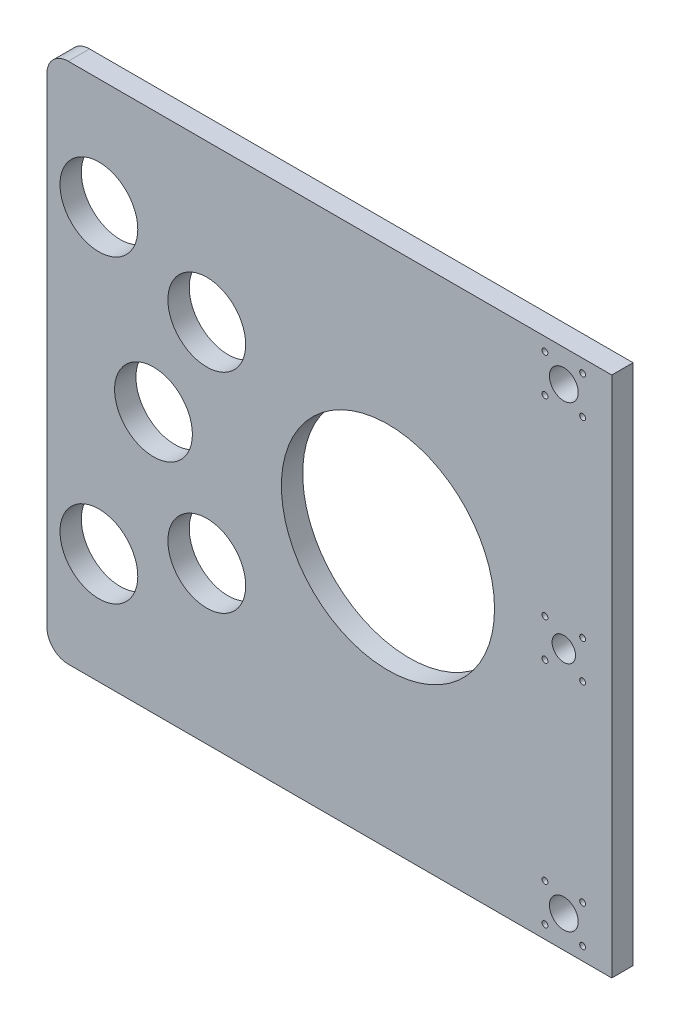
ISO-10303-21;
HEADER;
FILE_DESCRIPTION(('STEP AP214'),'2;1');
FILE_NAME('part.step','',(''),(''),'','','');
FILE_SCHEMA(('AUTOMOTIVE_DESIGN { 1 0 10303 214 1 1 1 1 }'));
ENDSEC;
DATA;
#1=APPLICATION_CONTEXT('core data for automotive mechanical design processes');
#2=APPLICATION_PROTOCOL_DEFINITION('international standard','automotive_design',2000,#1);
#3=PRODUCT_CONTEXT('',#1,'mechanical');
#4=PRODUCT('Part','Part','',(#3));
#5=PRODUCT_RELATED_PRODUCT_CATEGORY('part','',(#4));
#6=PRODUCT_DEFINITION_FORMATION('','',#4);
#7=PRODUCT_DEFINITION_CONTEXT('part definition',#1,'design');
#8=PRODUCT_DEFINITION('design','',#6,#7);
#9=PRODUCT_DEFINITION_SHAPE('','',#8);
#10=(LENGTH_UNIT() NAMED_UNIT(*) SI_UNIT(.MILLI.,.METRE.));
#11=(NAMED_UNIT(*) PLANE_ANGLE_UNIT() SI_UNIT($,.RADIAN.));
#12=(NAMED_UNIT(*) SI_UNIT($,.STERADIAN.) SOLID_ANGLE_UNIT());
#13=UNCERTAINTY_MEASURE_WITH_UNIT(LENGTH_MEASURE(1.E-05),#10,'distance_accuracy_value','');
#14=(GEOMETRIC_REPRESENTATION_CONTEXT(3) GLOBAL_UNCERTAINTY_ASSIGNED_CONTEXT((#13)) GLOBAL_UNIT_ASSIGNED_CONTEXT((#10,
#11,#12)) REPRESENTATION_CONTEXT('',''));
#15=CARTESIAN_POINT('',(0.,0.,0.));
#16=DIRECTION('',(0.,0.,1.));
#17=DIRECTION('',(1.,0.,0.));
#18=AXIS2_PLACEMENT_3D('',#15,#16,#17);
#19=CARTESIAN_POINT('',(430.,0.,20.));
#20=DIRECTION('',(1.,0.,0.));
#21=DIRECTION('',(0.,0.,-1.));
#22=AXIS2_PLACEMENT_3D('',#19,#20,#21);
#23=PLANE('',#22);
#24=DIRECTION('',(0.,-1.,0.));
#25=VECTOR('',#24,1.);
#26=CARTESIAN_POINT('',(430.,0.,0.));
#27=LINE('',#26,#25);
#28=CARTESIAN_POINT('',(430.,245.,0.));
#29=VERTEX_POINT('',#28);
#30=CARTESIAN_POINT('',(430.,-245.,0.));
#31=VERTEX_POINT('',#30);
#32=EDGE_CURVE('E104',#29,#31,#27,.T.);
#33=ORIENTED_EDGE('',*,*,#32,.F.);
#34=DIRECTION('',(0.,0.,-1.));
#35=VECTOR('',#34,1.);
#36=CARTESIAN_POINT('',(430.,245.,20.));
#37=LINE('',#36,#35);
#38=CARTESIAN_POINT('',(430.,245.,20.));
#39=VERTEX_POINT('',#38);
#40=EDGE_CURVE('E93',#39,#29,#37,.T.);
#41=ORIENTED_EDGE('',*,*,#40,.F.);
#42=DIRECTION('',(0.,-1.,0.));
#43=VECTOR('',#42,1.);
#44=CARTESIAN_POINT('',(430.,0.,20.));
#45=LINE('',#44,#43);
#46=CARTESIAN_POINT('',(430.,-245.,20.));
#47=VERTEX_POINT('',#46);
#48=EDGE_CURVE('E98',#39,#47,#45,.T.);
#49=ORIENTED_EDGE('',*,*,#48,.T.);
#50=DIRECTION('',(0.,0.,-1.));
#51=VECTOR('',#50,1.);
#52=CARTESIAN_POINT('',(430.,-245.,20.));
#53=LINE('',#52,#51);
#54=EDGE_CURVE('E106',#47,#31,#53,.T.);
#55=ORIENTED_EDGE('',*,*,#54,.T.);
#56=EDGE_LOOP('',(#33,#41,#49,#55));
#57=FACE_BOUND('',#56,.T.);
#58=ADVANCED_FACE('F37',(#57),#23,.T.);
#59=CARTESIAN_POINT('',(0.,245.,20.));
#60=DIRECTION('',(0.,1.,0.));
#61=DIRECTION('',(0.,0.,1.));
#62=AXIS2_PLACEMENT_3D('',#59,#60,#61);
#63=PLANE('',#62);
#64=DIRECTION('',(1.,0.,0.));
#65=VECTOR('',#64,1.);
#66=CARTESIAN_POINT('',(0.,245.,0.));
#67=LINE('',#66,#65);
#68=CARTESIAN_POINT('',(-80.,245.,0.));
#69=VERTEX_POINT('',#68);
#70=EDGE_CURVE('E183',#69,#29,#67,.T.);
#71=ORIENTED_EDGE('',*,*,#70,.F.);
#72=DIRECTION('',(0.,0.,-1.));
#73=VECTOR('',#72,1.);
#74=CARTESIAN_POINT('',(-80.,245.,20.));
#75=LINE('',#74,#73);
#76=CARTESIAN_POINT('',(-80.,245.,20.));
#77=VERTEX_POINT('',#76);
#78=EDGE_CURVE('E60',#69,#77,#75,.F.);
#79=ORIENTED_EDGE('',*,*,#78,.T.);
#80=DIRECTION('',(1.,0.,0.));
#81=VECTOR('',#80,1.);
#82=CARTESIAN_POINT('',(0.,245.,20.));
#83=LINE('',#82,#81);
#84=EDGE_CURVE('E90',#77,#39,#83,.T.);
#85=ORIENTED_EDGE('',*,*,#84,.T.);
#86=ORIENTED_EDGE('',*,*,#40,.T.);
#87=EDGE_LOOP('',(#71,#79,#85,#86));
#88=FACE_BOUND('',#87,.T.);
#89=ADVANCED_FACE('F92',(#88),#63,.T.);
#90=CARTESIAN_POINT('',(-100.,0.,20.));
#91=DIRECTION('',(1.,0.,0.));
#92=DIRECTION('',(0.,0.,-1.));
#93=AXIS2_PLACEMENT_3D('',#90,#91,#92);
#94=PLANE('',#93);
#95=DIRECTION('',(0.,-1.,0.));
#96=VECTOR('',#95,1.);
#97=CARTESIAN_POINT('',(-100.,0.,20.));
#98=LINE('',#97,#96);
#99=CARTESIAN_POINT('',(-100.,225.,20.));
#100=VERTEX_POINT('',#99);
#101=CARTESIAN_POINT('',(-100.,-225.,20.));
#102=VERTEX_POINT('',#101);
#103=EDGE_CURVE('E97',#100,#102,#98,.T.);
#104=ORIENTED_EDGE('',*,*,#103,.F.);
#105=DIRECTION('',(0.,0.,-1.));
#106=VECTOR('',#105,1.);
#107=CARTESIAN_POINT('',(-100.,225.,0.));
#108=LINE('',#107,#106);
#109=CARTESIAN_POINT('',(-100.,225.,0.));
#110=VERTEX_POINT('',#109);
#111=EDGE_CURVE('E232',#100,#110,#108,.T.);
#112=ORIENTED_EDGE('',*,*,#111,.T.);
#113=DIRECTION('',(0.,-1.,0.));
#114=VECTOR('',#113,1.);
#115=CARTESIAN_POINT('',(-100.,0.,0.));
#116=LINE('',#115,#114);
#117=CARTESIAN_POINT('',(-100.,-225.,0.));
#118=VERTEX_POINT('',#117);
#119=EDGE_CURVE('E185',#110,#118,#116,.T.);
#120=ORIENTED_EDGE('',*,*,#119,.T.);
#121=DIRECTION('',(0.,0.,-1.));
#122=VECTOR('',#121,1.);
#123=CARTESIAN_POINT('',(-100.,-225.,20.));
#124=LINE('',#123,#122);
#125=EDGE_CURVE('E105',#118,#102,#124,.F.);
#126=ORIENTED_EDGE('',*,*,#125,.T.);
#127=EDGE_LOOP('',(#104,#112,#120,#126));
#128=FACE_BOUND('',#127,.T.);
#129=ADVANCED_FACE('F244',(#128),#94,.F.);
#130=CARTESIAN_POINT('',(402.677669529664,-197.322330470336,20.));
#131=DIRECTION('',(0.,0.,-1.));
#132=DIRECTION('',(-1.,0.,0.));
#133=AXIS2_PLACEMENT_3D('',#130,#131,#132);
#134=CYLINDRICAL_SURFACE('',#133,2.75000000000004);
#135=CARTESIAN_POINT('',(402.677669529664,-197.322330470336,20.));
#136=DIRECTION('',(0.,0.,1.));
#137=DIRECTION('',(1.,0.,0.));
#138=AXIS2_PLACEMENT_3D('',#135,#136,#137);
#139=CIRCLE('',#138,2.75000000000004);
#140=CARTESIAN_POINT('',(405.427669529664,-197.322330470336,20.));
#141=VERTEX_POINT('',#140);
#142=EDGE_CURVE('E154',#141,#141,#139,.F.);
#143=ORIENTED_EDGE('',*,*,#142,.F.);
#144=EDGE_LOOP('',(#143));
#145=FACE_BOUND('',#144,.T.);
#146=CARTESIAN_POINT('',(402.677669529664,-197.322330470336,0.));
#147=DIRECTION('',(0.,0.,1.));
#148=DIRECTION('',(1.,0.,0.));
#149=AXIS2_PLACEMENT_3D('',#146,#147,#148);
#150=CIRCLE('',#149,2.75000000000004);
#151=CARTESIAN_POINT('',(405.427669529664,-197.322330470336,0.));
#152=VERTEX_POINT('',#151);
#153=EDGE_CURVE('E223',#152,#152,#150,.F.);
#154=ORIENTED_EDGE('',*,*,#153,.T.);
#155=EDGE_LOOP('',(#154));
#156=FACE_BOUND('',#155,.T.);
#157=ADVANCED_FACE('F322',(#145,#156),#134,.F.);
#158=CARTESIAN_POINT('',(367.322330470336,-232.677669529664,20.));
#159=DIRECTION('',(0.,0.,-1.));
#160=DIRECTION('',(-1.,0.,0.));
#161=AXIS2_PLACEMENT_3D('',#158,#159,#160);
#162=CYLINDRICAL_SURFACE('',#161,2.75000000000004);
#163=CARTESIAN_POINT('',(367.322330470336,-232.677669529664,20.));
#164=DIRECTION('',(0.,0.,1.));
#165=DIRECTION('',(1.,0.,0.));
#166=AXIS2_PLACEMENT_3D('',#163,#164,#165);
#167=CIRCLE('',#166,2.75000000000004);
#168=CARTESIAN_POINT('',(370.072330470336,-232.677669529664,20.));
#169=VERTEX_POINT('',#168);
#170=EDGE_CURVE('E151',#169,#169,#167,.F.);
#171=ORIENTED_EDGE('',*,*,#170,.F.);
#172=EDGE_LOOP('',(#171));
#173=FACE_BOUND('',#172,.T.);
#174=CARTESIAN_POINT('',(367.322330470336,-232.677669529664,0.));
#175=DIRECTION('',(0.,0.,1.));
#176=DIRECTION('',(1.,0.,0.));
#177=AXIS2_PLACEMENT_3D('',#174,#175,#176);
#178=CIRCLE('',#177,2.75000000000004);
#179=CARTESIAN_POINT('',(370.072330470336,-232.677669529664,0.));
#180=VERTEX_POINT('',#179);
#181=EDGE_CURVE('E220',#180,#180,#178,.F.);
#182=ORIENTED_EDGE('',*,*,#181,.T.);
#183=EDGE_LOOP('',(#182));
#184=FACE_BOUND('',#183,.T.);
#185=ADVANCED_FACE('F325',(#173,#184),#162,.F.);
#186=CARTESIAN_POINT('',(367.322330470336,232.677669529664,20.));
#187=DIRECTION('',(0.,0.,-1.));
#188=DIRECTION('',(-1.,0.,0.));
#189=AXIS2_PLACEMENT_3D('',#186,#187,#188);
#190=CYLINDRICAL_SURFACE('',#189,2.75000000000027);
#191=CARTESIAN_POINT('',(367.322330470336,232.677669529664,20.));
#192=DIRECTION('',(0.,0.,1.));
#193=DIRECTION('',(1.,0.,0.));
#194=AXIS2_PLACEMENT_3D('',#191,#192,#193);
#195=CIRCLE('',#194,2.75000000000027);
#196=CARTESIAN_POINT('',(370.072330470337,232.677669529664,20.));
#197=VERTEX_POINT('',#196);
#198=EDGE_CURVE('E148',#197,#197,#195,.T.);
#199=ORIENTED_EDGE('',*,*,#198,.T.);
#200=EDGE_LOOP('',(#199));
#201=FACE_BOUND('',#200,.T.);
#202=CARTESIAN_POINT('',(367.322330470336,232.677669529664,0.));
#203=DIRECTION('',(0.,0.,1.));
#204=DIRECTION('',(1.,0.,0.));
#205=AXIS2_PLACEMENT_3D('',#202,#203,#204);
#206=CIRCLE('',#205,2.75000000000027);
#207=CARTESIAN_POINT('',(370.072330470337,232.677669529664,0.));
#208=VERTEX_POINT('',#207);
#209=EDGE_CURVE('E217',#208,#208,#206,.T.);
#210=ORIENTED_EDGE('',*,*,#209,.F.);
#211=EDGE_LOOP('',(#210));
#212=FACE_BOUND('',#211,.T.);
#213=ADVANCED_FACE('F329',(#201,#212),#190,.F.);
#214=CARTESIAN_POINT('',(402.677669529664,232.677669529664,20.));
#215=DIRECTION('',(0.,0.,-1.));
#216=DIRECTION('',(-1.,0.,0.));
#217=AXIS2_PLACEMENT_3D('',#214,#215,#216);
#218=CYLINDRICAL_SURFACE('',#217,2.75000000000004);
#219=CARTESIAN_POINT('',(402.677669529664,232.677669529664,20.));
#220=DIRECTION('',(0.,0.,1.));
#221=DIRECTION('',(1.,0.,0.));
#222=AXIS2_PLACEMENT_3D('',#219,#220,#221);
#223=CIRCLE('',#222,2.75000000000004);
#224=CARTESIAN_POINT('',(405.427669529664,232.677669529664,20.));
#225=VERTEX_POINT('',#224);
#226=EDGE_CURVE('E145',#225,#225,#223,.T.);
#227=ORIENTED_EDGE('',*,*,#226,.T.);
#228=EDGE_LOOP('',(#227));
#229=FACE_BOUND('',#228,.T.);
#230=CARTESIAN_POINT('',(402.677669529664,232.677669529664,0.));
#231=DIRECTION('',(0.,0.,1.));
#232=DIRECTION('',(1.,0.,0.));
#233=AXIS2_PLACEMENT_3D('',#230,#231,#232);
#234=CIRCLE('',#233,2.75000000000004);
#235=CARTESIAN_POINT('',(405.427669529664,232.677669529664,0.));
#236=VERTEX_POINT('',#235);
#237=EDGE_CURVE('E214',#236,#236,#234,.T.);
#238=ORIENTED_EDGE('',*,*,#237,.F.);
#239=EDGE_LOOP('',(#238));
#240=FACE_BOUND('',#239,.T.);
#241=ADVANCED_FACE('F333',(#229,#240),#218,.F.);
#242=CARTESIAN_POINT('',(402.677669529664,197.322330470336,20.));
#243=DIRECTION('',(0.,0.,-1.));
#244=DIRECTION('',(-1.,0.,0.));
#245=AXIS2_PLACEMENT_3D('',#242,#243,#244);
#246=CYLINDRICAL_SURFACE('',#245,2.75000000000004);
#247=CARTESIAN_POINT('',(402.677669529664,197.322330470336,20.));
#248=DIRECTION('',(0.,0.,1.));
#249=DIRECTION('',(1.,0.,0.));
#250=AXIS2_PLACEMENT_3D('',#247,#248,#249);
#251=CIRCLE('',#250,2.75000000000004);
#252=CARTESIAN_POINT('',(405.427669529664,197.322330470336,20.));
#253=VERTEX_POINT('',#252);
#254=EDGE_CURVE('E142',#253,#253,#251,.T.);
#255=ORIENTED_EDGE('',*,*,#254,.T.);
#256=EDGE_LOOP('',(#255));
#257=FACE_BOUND('',#256,.T.);
#258=CARTESIAN_POINT('',(402.677669529664,197.322330470336,0.));
#259=DIRECTION('',(0.,0.,1.));
#260=DIRECTION('',(1.,0.,0.));
#261=AXIS2_PLACEMENT_3D('',#258,#259,#260);
#262=CIRCLE('',#261,2.75000000000004);
#263=CARTESIAN_POINT('',(405.427669529664,197.322330470336,0.));
#264=VERTEX_POINT('',#263);
#265=EDGE_CURVE('E211',#264,#264,#262,.T.);
#266=ORIENTED_EDGE('',*,*,#265,.F.);
#267=EDGE_LOOP('',(#266));
#268=FACE_BOUND('',#267,.T.);
#269=ADVANCED_FACE('F337',(#257,#268),#246,.F.);
#270=CARTESIAN_POINT('',(367.322330470336,197.322330470336,20.));
#271=DIRECTION('',(0.,0.,-1.));
#272=DIRECTION('',(-1.,0.,0.));
#273=AXIS2_PLACEMENT_3D('',#270,#271,#272);
#274=CYLINDRICAL_SURFACE('',#273,2.75000000000004);
#275=CARTESIAN_POINT('',(367.322330470336,197.322330470336,20.));
#276=DIRECTION('',(0.,0.,1.));
#277=DIRECTION('',(1.,0.,0.));
#278=AXIS2_PLACEMENT_3D('',#275,#276,#277);
#279=CIRCLE('',#278,2.75000000000004);
#280=CARTESIAN_POINT('',(370.072330470336,197.322330470336,20.));
#281=VERTEX_POINT('',#280);
#282=EDGE_CURVE('E139',#281,#281,#279,.T.);
#283=ORIENTED_EDGE('',*,*,#282,.T.);
#284=EDGE_LOOP('',(#283));
#285=FACE_BOUND('',#284,.T.);
#286=CARTESIAN_POINT('',(367.322330470336,197.322330470336,0.));
#287=DIRECTION('',(0.,0.,1.));
#288=DIRECTION('',(1.,0.,0.));
#289=AXIS2_PLACEMENT_3D('',#286,#287,#288);
#290=CIRCLE('',#289,2.75000000000004);
#291=CARTESIAN_POINT('',(370.072330470336,197.322330470336,0.));
#292=VERTEX_POINT('',#291);
#293=EDGE_CURVE('E208',#292,#292,#290,.T.);
#294=ORIENTED_EDGE('',*,*,#293,.F.);
#295=EDGE_LOOP('',(#294));
#296=FACE_BOUND('',#295,.T.);
#297=ADVANCED_FACE('F341',(#285,#296),#274,.F.);
#298=CARTESIAN_POINT('',(385.,215.,20.));
#299=DIRECTION('',(0.,0.,-1.));
#300=DIRECTION('',(-1.,0.,0.));
#301=AXIS2_PLACEMENT_3D('',#298,#299,#300);
#302=CYLINDRICAL_SURFACE('',#301,13.5);
#303=CARTESIAN_POINT('',(385.,215.,20.));
#304=DIRECTION('',(0.,0.,1.));
#305=DIRECTION('',(1.,0.,0.));
#306=AXIS2_PLACEMENT_3D('',#303,#304,#305);
#307=CIRCLE('',#306,13.5);
#308=CARTESIAN_POINT('',(398.5,215.,20.));
#309=VERTEX_POINT('',#308);
#310=EDGE_CURVE('E136',#309,#309,#307,.T.);
#311=ORIENTED_EDGE('',*,*,#310,.T.);
#312=EDGE_LOOP('',(#311));
#313=FACE_BOUND('',#312,.T.);
#314=CARTESIAN_POINT('',(385.,215.,0.));
#315=DIRECTION('',(0.,0.,1.));
#316=DIRECTION('',(1.,0.,0.));
#317=AXIS2_PLACEMENT_3D('',#314,#315,#316);
#318=CIRCLE('',#317,13.5);
#319=CARTESIAN_POINT('',(398.5,215.,0.));
#320=VERTEX_POINT('',#319);
#321=EDGE_CURVE('E205',#320,#320,#318,.T.);
#322=ORIENTED_EDGE('',*,*,#321,.F.);
#323=EDGE_LOOP('',(#322));
#324=FACE_BOUND('',#323,.T.);
#325=ADVANCED_FACE('F345',(#313,#324),#302,.F.);
#326=CARTESIAN_POINT('',(402.677669529664,-17.6776695296638,20.));
#327=DIRECTION('',(0.,0.,-1.));
#328=DIRECTION('',(-1.,0.,0.));
#329=AXIS2_PLACEMENT_3D('',#326,#327,#328);
#330=CYLINDRICAL_SURFACE('',#329,2.75000000000004);
#331=CARTESIAN_POINT('',(402.677669529664,-17.6776695296638,20.));
#332=DIRECTION('',(0.,0.,1.));
#333=DIRECTION('',(1.,0.,0.));
#334=AXIS2_PLACEMENT_3D('',#331,#332,#333);
#335=CIRCLE('',#334,2.75000000000004);
#336=CARTESIAN_POINT('',(405.427669529664,-17.6776695296638,20.));
#337=VERTEX_POINT('',#336);
#338=EDGE_CURVE('E133',#337,#337,#335,.T.);
#339=ORIENTED_EDGE('',*,*,#338,.T.);
#340=EDGE_LOOP('',(#339));
#341=FACE_BOUND('',#340,.T.);
#342=CARTESIAN_POINT('',(402.677669529664,-17.6776695296638,0.));
#343=DIRECTION('',(0.,0.,1.));
#344=DIRECTION('',(1.,0.,0.));
#345=AXIS2_PLACEMENT_3D('',#342,#343,#344);
#346=CIRCLE('',#345,2.75000000000004);
#347=CARTESIAN_POINT('',(405.427669529664,-17.6776695296638,0.));
#348=VERTEX_POINT('',#347);
#349=EDGE_CURVE('E202',#348,#348,#346,.T.);
#350=ORIENTED_EDGE('',*,*,#349,.F.);
#351=EDGE_LOOP('',(#350));
#352=FACE_BOUND('',#351,.T.);
#353=ADVANCED_FACE('F349',(#341,#352),#330,.F.);
#354=CARTESIAN_POINT('',(367.322330470336,-17.6776695296638,20.));
#355=DIRECTION('',(0.,0.,-1.));
#356=DIRECTION('',(-1.,0.,0.));
#357=AXIS2_PLACEMENT_3D('',#354,#355,#356);
#358=CYLINDRICAL_SURFACE('',#357,2.75000000000004);
#359=CARTESIAN_POINT('',(367.322330470336,-17.6776695296638,20.));
#360=DIRECTION('',(0.,0.,1.));
#361=DIRECTION('',(1.,0.,0.));
#362=AXIS2_PLACEMENT_3D('',#359,#360,#361);
#363=CIRCLE('',#362,2.75000000000004);
#364=CARTESIAN_POINT('',(370.072330470336,-17.6776695296638,20.));
#365=VERTEX_POINT('',#364);
#366=EDGE_CURVE('E130',#365,#365,#363,.T.);
#367=ORIENTED_EDGE('',*,*,#366,.T.);
#368=EDGE_LOOP('',(#367));
#369=FACE_BOUND('',#368,.T.);
#370=CARTESIAN_POINT('',(367.322330470336,-17.6776695296638,0.));
#371=DIRECTION('',(0.,0.,1.));
#372=DIRECTION('',(1.,0.,0.));
#373=AXIS2_PLACEMENT_3D('',#370,#371,#372);
#374=CIRCLE('',#373,2.75000000000004);
#375=CARTESIAN_POINT('',(370.072330470336,-17.6776695296638,0.));
#376=VERTEX_POINT('',#375);
#377=EDGE_CURVE('E199',#376,#376,#374,.T.);
#378=ORIENTED_EDGE('',*,*,#377,.F.);
#379=EDGE_LOOP('',(#378));
#380=FACE_BOUND('',#379,.T.);
#381=ADVANCED_FACE('F353',(#369,#380),#358,.F.);
#382=CARTESIAN_POINT('',(402.677669529664,17.6776695296638,20.));
#383=DIRECTION('',(0.,0.,-1.));
#384=DIRECTION('',(-1.,0.,0.));
#385=AXIS2_PLACEMENT_3D('',#382,#383,#384);
#386=CYLINDRICAL_SURFACE('',#385,2.75000000000004);
#387=CARTESIAN_POINT('',(402.677669529664,17.6776695296638,20.));
#388=DIRECTION('',(0.,0.,1.));
#389=DIRECTION('',(1.,0.,0.));
#390=AXIS2_PLACEMENT_3D('',#387,#388,#389);
#391=CIRCLE('',#390,2.75000000000004);
#392=CARTESIAN_POINT('',(405.427669529664,17.6776695296638,20.));
#393=VERTEX_POINT('',#392);
#394=EDGE_CURVE('E127',#393,#393,#391,.T.);
#395=ORIENTED_EDGE('',*,*,#394,.T.);
#396=EDGE_LOOP('',(#395));
#397=FACE_BOUND('',#396,.T.);
#398=CARTESIAN_POINT('',(402.677669529664,17.6776695296638,0.));
#399=DIRECTION('',(0.,0.,1.));
#400=DIRECTION('',(1.,0.,0.));
#401=AXIS2_PLACEMENT_3D('',#398,#399,#400);
#402=CIRCLE('',#401,2.75000000000004);
#403=CARTESIAN_POINT('',(405.427669529664,17.6776695296638,0.));
#404=VERTEX_POINT('',#403);
#405=EDGE_CURVE('E196',#404,#404,#402,.T.);
#406=ORIENTED_EDGE('',*,*,#405,.F.);
#407=EDGE_LOOP('',(#406));
#408=FACE_BOUND('',#407,.T.);
#409=ADVANCED_FACE('F357',(#397,#408),#386,.F.);
#410=CARTESIAN_POINT('',(367.322330470336,17.6776695296638,20.));
#411=DIRECTION('',(0.,0.,-1.));
#412=DIRECTION('',(-1.,0.,0.));
#413=AXIS2_PLACEMENT_3D('',#410,#411,#412);
#414=CYLINDRICAL_SURFACE('',#413,2.75000000000004);
#415=CARTESIAN_POINT('',(367.322330470336,17.6776695296638,20.));
#416=DIRECTION('',(0.,0.,1.));
#417=DIRECTION('',(1.,0.,0.));
#418=AXIS2_PLACEMENT_3D('',#415,#416,#417);
#419=CIRCLE('',#418,2.75000000000004);
#420=CARTESIAN_POINT('',(370.072330470336,17.6776695296638,20.));
#421=VERTEX_POINT('',#420);
#422=EDGE_CURVE('E124',#421,#421,#419,.T.);
#423=ORIENTED_EDGE('',*,*,#422,.T.);
#424=EDGE_LOOP('',(#423));
#425=FACE_BOUND('',#424,.T.);
#426=CARTESIAN_POINT('',(367.322330470336,17.6776695296638,0.));
#427=DIRECTION('',(0.,0.,1.));
#428=DIRECTION('',(1.,0.,0.));
#429=AXIS2_PLACEMENT_3D('',#426,#427,#428);
#430=CIRCLE('',#429,2.75000000000004);
#431=CARTESIAN_POINT('',(370.072330470336,17.6776695296638,0.));
#432=VERTEX_POINT('',#431);
#433=EDGE_CURVE('E193',#432,#432,#430,.T.);
#434=ORIENTED_EDGE('',*,*,#433,.F.);
#435=EDGE_LOOP('',(#434));
#436=FACE_BOUND('',#435,.T.);
#437=ADVANCED_FACE('F267',(#425,#436),#414,.F.);
#438=CARTESIAN_POINT('',(385.,0.,20.));
#439=DIRECTION('',(0.,0.,-1.));
#440=DIRECTION('',(-1.,0.,0.));
#441=AXIS2_PLACEMENT_3D('',#438,#439,#440);
#442=CYLINDRICAL_SURFACE('',#441,11.);
#443=CARTESIAN_POINT('',(385.,0.,20.));
#444=DIRECTION('',(0.,0.,1.));
#445=DIRECTION('',(1.,0.,0.));
#446=AXIS2_PLACEMENT_3D('',#443,#444,#445);
#447=CIRCLE('',#446,11.);
#448=CARTESIAN_POINT('',(396.,0.,20.));
#449=VERTEX_POINT('',#448);
#450=EDGE_CURVE('E121',#449,#449,#447,.T.);
#451=ORIENTED_EDGE('',*,*,#450,.T.);
#452=EDGE_LOOP('',(#451));
#453=FACE_BOUND('',#452,.T.);
#454=CARTESIAN_POINT('',(385.,0.,0.));
#455=DIRECTION('',(0.,0.,1.));
#456=DIRECTION('',(1.,0.,0.));
#457=AXIS2_PLACEMENT_3D('',#454,#455,#456);
#458=CIRCLE('',#457,11.);
#459=CARTESIAN_POINT('',(396.,0.,0.));
#460=VERTEX_POINT('',#459);
#461=EDGE_CURVE('E190',#460,#460,#458,.T.);
#462=ORIENTED_EDGE('',*,*,#461,.F.);
#463=EDGE_LOOP('',(#462));
#464=FACE_BOUND('',#463,.T.);
#465=ADVANCED_FACE('F258',(#453,#464),#442,.F.);
#466=CARTESIAN_POINT('',(0.,-245.,20.));
#467=DIRECTION('',(0.,1.,0.));
#468=DIRECTION('',(0.,0.,1.));
#469=AXIS2_PLACEMENT_3D('',#466,#467,#468);
#470=PLANE('',#469);
#471=DIRECTION('',(1.,0.,0.));
#472=VECTOR('',#471,1.);
#473=CARTESIAN_POINT('',(0.,-245.,20.));
#474=LINE('',#473,#472);
#475=CARTESIAN_POINT('',(-80.,-245.,20.));
#476=VERTEX_POINT('',#475);
#477=EDGE_CURVE('E110',#476,#47,#474,.T.);
#478=ORIENTED_EDGE('',*,*,#477,.F.);
#479=DIRECTION('',(0.,0.,-1.));
#480=VECTOR('',#479,1.);
#481=CARTESIAN_POINT('',(-80.,-245.,20.));
#482=LINE('',#481,#480);
#483=CARTESIAN_POINT('',(-80.,-245.,0.));
#484=VERTEX_POINT('',#483);
#485=EDGE_CURVE('E11',#476,#484,#482,.T.);
#486=ORIENTED_EDGE('',*,*,#485,.T.);
#487=DIRECTION('',(1.,0.,0.));
#488=VECTOR('',#487,1.);
#489=CARTESIAN_POINT('',(0.,-245.,0.));
#490=LINE('',#489,#488);
#491=EDGE_CURVE('E188',#484,#31,#490,.T.);
#492=ORIENTED_EDGE('',*,*,#491,.T.);
#493=ORIENTED_EDGE('',*,*,#54,.F.);
#494=EDGE_LOOP('',(#478,#486,#492,#493));
#495=FACE_BOUND('',#494,.T.);
#496=ADVANCED_FACE('F255',(#495),#470,.F.);
#497=CARTESIAN_POINT('',(0.,0.,20.));
#498=DIRECTION('',(0.,0.,-1.));
#499=DIRECTION('',(-1.,0.,0.));
#500=AXIS2_PLACEMENT_3D('',#497,#498,#499);
#501=CYLINDRICAL_SURFACE('',#500,36.5);
#502=CARTESIAN_POINT('',(0.,0.,20.));
#503=DIRECTION('',(0.,0.,1.));
#504=DIRECTION('',(1.,0.,0.));
#505=AXIS2_PLACEMENT_3D('',#502,#503,#504);
#506=CIRCLE('',#505,36.5);
#507=CARTESIAN_POINT('',(36.5,0.,20.));
#508=VERTEX_POINT('',#507);
#509=EDGE_CURVE('E112',#508,#508,#506,.T.);
#510=ORIENTED_EDGE('',*,*,#509,.T.);
#511=EDGE_LOOP('',(#510));
#512=FACE_BOUND('',#511,.T.);
#513=CARTESIAN_POINT('',(0.,0.,0.));
#514=DIRECTION('',(0.,0.,1.));
#515=DIRECTION('',(1.,0.,0.));
#516=AXIS2_PLACEMENT_3D('',#513,#514,#515);
#517=CIRCLE('',#516,36.5);
#518=CARTESIAN_POINT('',(36.5,0.,0.));
#519=VERTEX_POINT('',#518);
#520=EDGE_CURVE('E179',#519,#519,#517,.T.);
#521=ORIENTED_EDGE('',*,*,#520,.F.);
#522=EDGE_LOOP('',(#521));
#523=FACE_BOUND('',#522,.T.);
#524=ADVANCED_FACE('F257',(#512,#523),#501,.F.);
#525=CARTESIAN_POINT('',(50.,97.9795897113271,20.));
#526=DIRECTION('',(0.,0.,-1.));
#527=DIRECTION('',(-1.,0.,0.));
#528=AXIS2_PLACEMENT_3D('',#525,#526,#527);
#529=CYLINDRICAL_SURFACE('',#528,36.5000000000001);
#530=CARTESIAN_POINT('',(50.,97.9795897113271,20.));
#531=DIRECTION('',(0.,0.,1.));
#532=DIRECTION('',(1.,0.,0.));
#533=AXIS2_PLACEMENT_3D('',#530,#531,#532);
#534=CIRCLE('',#533,36.5000000000001);
#535=CARTESIAN_POINT('',(86.5000000000001,97.9795897113271,20.));
#536=VERTEX_POINT('',#535);
#537=EDGE_CURVE('E115',#536,#536,#534,.T.);
#538=ORIENTED_EDGE('',*,*,#537,.T.);
#539=EDGE_LOOP('',(#538));
#540=FACE_BOUND('',#539,.T.);
#541=CARTESIAN_POINT('',(50.,97.9795897113271,0.));
#542=DIRECTION('',(0.,0.,1.));
#543=DIRECTION('',(1.,0.,0.));
#544=AXIS2_PLACEMENT_3D('',#541,#542,#543);
#545=CIRCLE('',#544,36.5000000000001);
#546=CARTESIAN_POINT('',(86.5000000000001,97.9795897113271,0.));
#547=VERTEX_POINT('',#546);
#548=EDGE_CURVE('E176',#547,#547,#545,.T.);
#549=ORIENTED_EDGE('',*,*,#548,.F.);
#550=EDGE_LOOP('',(#549));
#551=FACE_BOUND('',#550,.T.);
#552=ADVANCED_FACE('F264',(#540,#551),#529,.F.);
#553=CARTESIAN_POINT('',(50.,-97.9795897113271,20.));
#554=DIRECTION('',(0.,0.,-1.));
#555=DIRECTION('',(-1.,0.,0.));
#556=AXIS2_PLACEMENT_3D('',#553,#554,#555);
#557=CYLINDRICAL_SURFACE('',#556,36.5000000000001);
#558=CARTESIAN_POINT('',(50.,-97.9795897113271,20.));
#559=DIRECTION('',(0.,0.,1.));
#560=DIRECTION('',(1.,0.,0.));
#561=AXIS2_PLACEMENT_3D('',#558,#559,#560);
#562=CIRCLE('',#561,36.5000000000001);
#563=CARTESIAN_POINT('',(86.5000000000001,-97.9795897113271,20.));
#564=VERTEX_POINT('',#563);
#565=EDGE_CURVE('E550',#564,#564,#562,.T.);
#566=ORIENTED_EDGE('',*,*,#565,.T.);
#567=EDGE_LOOP('',(#566));
#568=FACE_BOUND('',#567,.T.);
#569=CARTESIAN_POINT('',(50.,-97.9795897113271,0.));
#570=DIRECTION('',(0.,0.,1.));
#571=DIRECTION('',(1.,0.,0.));
#572=AXIS2_PLACEMENT_3D('',#569,#570,#571);
#573=CIRCLE('',#572,36.5000000000001);
#574=CARTESIAN_POINT('',(86.5000000000001,-97.9795897113271,0.));
#575=VERTEX_POINT('',#574);
#576=EDGE_CURVE('E173',#575,#575,#573,.T.);
#577=ORIENTED_EDGE('',*,*,#576,.F.);
#578=EDGE_LOOP('',(#577));
#579=FACE_BOUND('',#578,.T.);
#580=ADVANCED_FACE('F280',(#568,#579),#557,.F.);
#581=CARTESIAN_POINT('',(-51.2499339393075,140.973204089347,20.));
#582=DIRECTION('',(0.,0.,-1.));
#583=DIRECTION('',(-1.,0.,0.));
#584=AXIS2_PLACEMENT_3D('',#581,#582,#583);
#585=CYLINDRICAL_SURFACE('',#584,36.5);
#586=CARTESIAN_POINT('',(-51.2499339393075,140.973204089347,20.));
#587=DIRECTION('',(0.,0.,1.));
#588=DIRECTION('',(1.,0.,0.));
#589=AXIS2_PLACEMENT_3D('',#586,#587,#588);
#590=CIRCLE('',#589,36.5);
#591=CARTESIAN_POINT('',(-14.7499339393075,140.973204089347,20.));
#592=VERTEX_POINT('',#591);
#593=EDGE_CURVE('E547',#592,#592,#590,.T.);
#594=ORIENTED_EDGE('',*,*,#593,.T.);
#595=EDGE_LOOP('',(#594));
#596=FACE_BOUND('',#595,.T.);
#597=CARTESIAN_POINT('',(-51.2499339393075,140.973204089347,0.));
#598=DIRECTION('',(0.,0.,1.));
#599=DIRECTION('',(1.,0.,0.));
#600=AXIS2_PLACEMENT_3D('',#597,#598,#599);
#601=CIRCLE('',#600,36.5);
#602=CARTESIAN_POINT('',(-14.7499339393075,140.973204089347,0.));
#603=VERTEX_POINT('',#602);
#604=EDGE_CURVE('E170',#603,#603,#601,.T.);
#605=ORIENTED_EDGE('',*,*,#604,.F.);
#606=EDGE_LOOP('',(#605));
#607=FACE_BOUND('',#606,.T.);
#608=ADVANCED_FACE('F284',(#596,#607),#585,.F.);
#609=CARTESIAN_POINT('',(-51.2499339393075,-140.973204089347,20.));
#610=DIRECTION('',(0.,0.,-1.));
#611=DIRECTION('',(-1.,0.,0.));
#612=AXIS2_PLACEMENT_3D('',#609,#610,#611);
#613=CYLINDRICAL_SURFACE('',#612,36.5);
#614=CARTESIAN_POINT('',(-51.2499339393075,-140.973204089347,20.));
#615=DIRECTION('',(0.,0.,1.));
#616=DIRECTION('',(1.,0.,0.));
#617=AXIS2_PLACEMENT_3D('',#614,#615,#616);
#618=CIRCLE('',#617,36.5);
#619=CARTESIAN_POINT('',(-14.7499339393075,-140.973204089347,20.));
#620=VERTEX_POINT('',#619);
#621=EDGE_CURVE('E544',#620,#620,#618,.F.);
#622=ORIENTED_EDGE('',*,*,#621,.F.);
#623=EDGE_LOOP('',(#622));
#624=FACE_BOUND('',#623,.T.);
#625=CARTESIAN_POINT('',(-51.2499339393075,-140.973204089347,0.));
#626=DIRECTION('',(0.,0.,1.));
#627=DIRECTION('',(1.,0.,0.));
#628=AXIS2_PLACEMENT_3D('',#625,#626,#627);
#629=CIRCLE('',#628,36.5);
#630=CARTESIAN_POINT('',(-14.7499339393075,-140.973204089347,0.));
#631=VERTEX_POINT('',#630);
#632=EDGE_CURVE('E167',#631,#631,#629,.F.);
#633=ORIENTED_EDGE('',*,*,#632,.T.);
#634=EDGE_LOOP('',(#633));
#635=FACE_BOUND('',#634,.T.);
#636=ADVANCED_FACE('F288',(#624,#635),#613,.F.);
#637=CARTESIAN_POINT('',(402.677669529664,-232.677669529664,20.));
#638=DIRECTION('',(0.,0.,-1.));
#639=DIRECTION('',(-1.,0.,0.));
#640=AXIS2_PLACEMENT_3D('',#637,#638,#639);
#641=CYLINDRICAL_SURFACE('',#640,2.75000000000004);
#642=CARTESIAN_POINT('',(402.677669529664,-232.677669529664,20.));
#643=DIRECTION('',(0.,0.,1.));
#644=DIRECTION('',(1.,0.,0.));
#645=AXIS2_PLACEMENT_3D('',#642,#643,#644);
#646=CIRCLE('',#645,2.75000000000004);
#647=CARTESIAN_POINT('',(405.427669529664,-232.677669529664,20.));
#648=VERTEX_POINT('',#647);
#649=EDGE_CURVE('E541',#648,#648,#646,.F.);
#650=ORIENTED_EDGE('',*,*,#649,.F.);
#651=EDGE_LOOP('',(#650));
#652=FACE_BOUND('',#651,.T.);
#653=CARTESIAN_POINT('',(402.677669529664,-232.677669529664,0.));
#654=DIRECTION('',(0.,0.,1.));
#655=DIRECTION('',(1.,0.,0.));
#656=AXIS2_PLACEMENT_3D('',#653,#654,#655);
#657=CIRCLE('',#656,2.75000000000004);
#658=CARTESIAN_POINT('',(405.427669529664,-232.677669529664,0.));
#659=VERTEX_POINT('',#658);
#660=EDGE_CURVE('E163',#659,#659,#657,.F.);
#661=ORIENTED_EDGE('',*,*,#660,.T.);
#662=EDGE_LOOP('',(#661));
#663=FACE_BOUND('',#662,.T.);
#664=ADVANCED_FACE('F292',(#652,#663),#641,.F.);
#665=CARTESIAN_POINT('',(367.322330470336,-197.322330470336,20.));
#666=DIRECTION('',(0.,0.,-1.));
#667=DIRECTION('',(-1.,0.,0.));
#668=AXIS2_PLACEMENT_3D('',#665,#666,#667);
#669=CYLINDRICAL_SURFACE('',#668,2.75000000000004);
#670=CARTESIAN_POINT('',(367.322330470336,-197.322330470336,20.));
#671=DIRECTION('',(0.,0.,1.));
#672=DIRECTION('',(1.,0.,0.));
#673=AXIS2_PLACEMENT_3D('',#670,#671,#672);
#674=CIRCLE('',#673,2.75000000000004);
#675=CARTESIAN_POINT('',(370.072330470336,-197.322330470336,20.));
#676=VERTEX_POINT('',#675);
#677=EDGE_CURVE('E229',#676,#676,#674,.F.);
#678=ORIENTED_EDGE('',*,*,#677,.F.);
#679=EDGE_LOOP('',(#678));
#680=FACE_BOUND('',#679,.T.);
#681=CARTESIAN_POINT('',(367.322330470336,-197.322330470336,0.));
#682=DIRECTION('',(0.,0.,1.));
#683=DIRECTION('',(1.,0.,0.));
#684=AXIS2_PLACEMENT_3D('',#681,#682,#683);
#685=CIRCLE('',#684,2.75000000000004);
#686=CARTESIAN_POINT('',(370.072330470336,-197.322330470336,0.));
#687=VERTEX_POINT('',#686);
#688=EDGE_CURVE('E160',#687,#687,#685,.F.);
#689=ORIENTED_EDGE('',*,*,#688,.T.);
#690=EDGE_LOOP('',(#689));
#691=FACE_BOUND('',#690,.T.);
#692=ADVANCED_FACE('F296',(#680,#691),#669,.F.);
#693=CARTESIAN_POINT('',(385.,-215.,20.));
#694=DIRECTION('',(0.,0.,-1.));
#695=DIRECTION('',(-1.,0.,0.));
#696=AXIS2_PLACEMENT_3D('',#693,#694,#695);
#697=CYLINDRICAL_SURFACE('',#696,13.5);
#698=CARTESIAN_POINT('',(385.,-215.,20.));
#699=DIRECTION('',(0.,0.,1.));
#700=DIRECTION('',(1.,0.,0.));
#701=AXIS2_PLACEMENT_3D('',#698,#699,#700);
#702=CIRCLE('',#701,13.5);
#703=CARTESIAN_POINT('',(398.5,-215.,20.));
#704=VERTEX_POINT('',#703);
#705=EDGE_CURVE('E157',#704,#704,#702,.F.);
#706=ORIENTED_EDGE('',*,*,#705,.F.);
#707=EDGE_LOOP('',(#706));
#708=FACE_BOUND('',#707,.T.);
#709=CARTESIAN_POINT('',(385.,-215.,0.));
#710=DIRECTION('',(0.,0.,1.));
#711=DIRECTION('',(1.,0.,0.));
#712=AXIS2_PLACEMENT_3D('',#709,#710,#711);
#713=CIRCLE('',#712,13.5);
#714=CARTESIAN_POINT('',(398.5,-215.,0.));
#715=VERTEX_POINT('',#714);
#716=EDGE_CURVE('E226',#715,#715,#713,.F.);
#717=ORIENTED_EDGE('',*,*,#716,.T.);
#718=EDGE_LOOP('',(#717));
#719=FACE_BOUND('',#718,.T.);
#720=ADVANCED_FACE('F299',(#708,#719),#697,.F.);
#721=CARTESIAN_POINT('',(0.,0.,20.));
#722=DIRECTION('',(0.,0.,1.));
#723=DIRECTION('',(1.,0.,0.));
#724=AXIS2_PLACEMENT_3D('',#721,#722,#723);
#725=PLANE('',#724);
#726=CARTESIAN_POINT('',(220.,0.,20.));
#727=DIRECTION('',(0.,0.,1.));
#728=DIRECTION('',(1.,0.,0.));
#729=AXIS2_PLACEMENT_3D('',#726,#727,#728);
#730=CIRCLE('',#729,100.);
#731=CARTESIAN_POINT('',(320.,0.,20.));
#732=VERTEX_POINT('',#731);
#733=EDGE_CURVE('E535',#732,#732,#730,.T.);
#734=ORIENTED_EDGE('',*,*,#733,.F.);
#735=EDGE_LOOP('',(#734));
#736=FACE_BOUND('',#735,.T.);
#737=ORIENTED_EDGE('',*,*,#677,.T.);
#738=EDGE_LOOP('',(#737));
#739=FACE_BOUND('',#738,.T.);
#740=ORIENTED_EDGE('',*,*,#649,.T.);
#741=EDGE_LOOP('',(#740));
#742=FACE_BOUND('',#741,.T.);
#743=ORIENTED_EDGE('',*,*,#621,.T.);
#744=EDGE_LOOP('',(#743));
#745=FACE_BOUND('',#744,.T.);
#746=ORIENTED_EDGE('',*,*,#593,.F.);
#747=EDGE_LOOP('',(#746));
#748=FACE_BOUND('',#747,.T.);
#749=ORIENTED_EDGE('',*,*,#565,.F.);
#750=EDGE_LOOP('',(#749));
#751=FACE_BOUND('',#750,.T.);
#752=ORIENTED_EDGE('',*,*,#537,.F.);
#753=EDGE_LOOP('',(#752));
#754=FACE_BOUND('',#753,.T.);
#755=ORIENTED_EDGE('',*,*,#509,.F.);
#756=EDGE_LOOP('',(#755));
#757=FACE_BOUND('',#756,.T.);
#758=ORIENTED_EDGE('',*,*,#84,.F.);
#759=CARTESIAN_POINT('',(-80.,225.,20.));
#760=DIRECTION('',(0.,0.,1.));
#761=DIRECTION('',(1.,0.,0.));
#762=AXIS2_PLACEMENT_3D('',#759,#760,#761);
#763=CIRCLE('',#762,20.);
#764=EDGE_CURVE('E45',#77,#100,#763,.T.);
#765=ORIENTED_EDGE('',*,*,#764,.T.);
#766=ORIENTED_EDGE('',*,*,#103,.T.);
#767=CARTESIAN_POINT('',(-80.,-225.,20.));
#768=DIRECTION('',(0.,0.,1.));
#769=DIRECTION('',(1.,0.,0.));
#770=AXIS2_PLACEMENT_3D('',#767,#768,#769);
#771=CIRCLE('',#770,20.);
#772=EDGE_CURVE('E52',#102,#476,#771,.T.);
#773=ORIENTED_EDGE('',*,*,#772,.T.);
#774=ORIENTED_EDGE('',*,*,#477,.T.);
#775=ORIENTED_EDGE('',*,*,#48,.F.);
#776=EDGE_LOOP('',(#758,#765,#766,#773,#774,#775));
#777=FACE_BOUND('',#776,.T.);
#778=ORIENTED_EDGE('',*,*,#450,.F.);
#779=EDGE_LOOP('',(#778));
#780=FACE_BOUND('',#779,.T.);
#781=ORIENTED_EDGE('',*,*,#422,.F.);
#782=EDGE_LOOP('',(#781));
#783=FACE_BOUND('',#782,.T.);
#784=ORIENTED_EDGE('',*,*,#394,.F.);
#785=EDGE_LOOP('',(#784));
#786=FACE_BOUND('',#785,.T.);
#787=ORIENTED_EDGE('',*,*,#366,.F.);
#788=EDGE_LOOP('',(#787));
#789=FACE_BOUND('',#788,.T.);
#790=ORIENTED_EDGE('',*,*,#338,.F.);
#791=EDGE_LOOP('',(#790));
#792=FACE_BOUND('',#791,.T.);
#793=ORIENTED_EDGE('',*,*,#310,.F.);
#794=EDGE_LOOP('',(#793));
#795=FACE_BOUND('',#794,.T.);
#796=ORIENTED_EDGE('',*,*,#282,.F.);
#797=EDGE_LOOP('',(#796));
#798=FACE_BOUND('',#797,.T.);
#799=ORIENTED_EDGE('',*,*,#254,.F.);
#800=EDGE_LOOP('',(#799));
#801=FACE_BOUND('',#800,.T.);
#802=ORIENTED_EDGE('',*,*,#226,.F.);
#803=EDGE_LOOP('',(#802));
#804=FACE_BOUND('',#803,.T.);
#805=ORIENTED_EDGE('',*,*,#198,.F.);
#806=EDGE_LOOP('',(#805));
#807=FACE_BOUND('',#806,.T.);
#808=ORIENTED_EDGE('',*,*,#170,.T.);
#809=EDGE_LOOP('',(#808));
#810=FACE_BOUND('',#809,.T.);
#811=ORIENTED_EDGE('',*,*,#142,.T.);
#812=EDGE_LOOP('',(#811));
#813=FACE_BOUND('',#812,.T.);
#814=ORIENTED_EDGE('',*,*,#705,.T.);
#815=EDGE_LOOP('',(#814));
#816=FACE_BOUND('',#815,.T.);
#817=ADVANCED_FACE('F108',(#736,#739,#742,#745,#748,#751,#754,#757,#777,#780,#783,#786,#789,
#792,#795,#798,#801,#804,#807,#810,#813,#816),#725,.T.);
#818=CARTESIAN_POINT('',(0.,0.,0.));
#819=DIRECTION('',(0.,0.,1.));
#820=DIRECTION('',(1.,0.,0.));
#821=AXIS2_PLACEMENT_3D('',#818,#819,#820);
#822=PLANE('',#821);
#823=CARTESIAN_POINT('',(220.,0.,0.));
#824=DIRECTION('',(0.,0.,1.));
#825=DIRECTION('',(1.,0.,0.));
#826=AXIS2_PLACEMENT_3D('',#823,#824,#825);
#827=CIRCLE('',#826,100.);
#828=CARTESIAN_POINT('',(320.,0.,0.));
#829=VERTEX_POINT('',#828);
#830=EDGE_CURVE('E164',#829,#829,#827,.T.);
#831=ORIENTED_EDGE('',*,*,#830,.T.);
#832=EDGE_LOOP('',(#831));
#833=FACE_BOUND('',#832,.T.);
#834=ORIENTED_EDGE('',*,*,#688,.F.);
#835=EDGE_LOOP('',(#834));
#836=FACE_BOUND('',#835,.T.);
#837=ORIENTED_EDGE('',*,*,#660,.F.);
#838=EDGE_LOOP('',(#837));
#839=FACE_BOUND('',#838,.T.);
#840=ORIENTED_EDGE('',*,*,#632,.F.);
#841=EDGE_LOOP('',(#840));
#842=FACE_BOUND('',#841,.T.);
#843=ORIENTED_EDGE('',*,*,#604,.T.);
#844=EDGE_LOOP('',(#843));
#845=FACE_BOUND('',#844,.T.);
#846=ORIENTED_EDGE('',*,*,#576,.T.);
#847=EDGE_LOOP('',(#846));
#848=FACE_BOUND('',#847,.T.);
#849=ORIENTED_EDGE('',*,*,#548,.T.);
#850=EDGE_LOOP('',(#849));
#851=FACE_BOUND('',#850,.T.);
#852=ORIENTED_EDGE('',*,*,#520,.T.);
#853=EDGE_LOOP('',(#852));
#854=FACE_BOUND('',#853,.T.);
#855=ORIENTED_EDGE('',*,*,#119,.F.);
#856=CARTESIAN_POINT('',(-80.,225.,0.));
#857=DIRECTION('',(0.,0.,1.));
#858=DIRECTION('',(1.,0.,0.));
#859=AXIS2_PLACEMENT_3D('',#856,#857,#858);
#860=CIRCLE('',#859,20.);
#861=EDGE_CURVE('E237',#110,#69,#860,.F.);
#862=ORIENTED_EDGE('',*,*,#861,.T.);
#863=ORIENTED_EDGE('',*,*,#70,.T.);
#864=ORIENTED_EDGE('',*,*,#32,.T.);
#865=ORIENTED_EDGE('',*,*,#491,.F.);
#866=CARTESIAN_POINT('',(-80.,-225.,0.));
#867=DIRECTION('',(0.,0.,1.));
#868=DIRECTION('',(1.,0.,0.));
#869=AXIS2_PLACEMENT_3D('',#866,#867,#868);
#870=CIRCLE('',#869,20.);
#871=EDGE_CURVE('E235',#484,#118,#870,.F.);
#872=ORIENTED_EDGE('',*,*,#871,.T.);
#873=EDGE_LOOP('',(#855,#862,#863,#864,#865,#872));
#874=FACE_BOUND('',#873,.T.);
#875=ORIENTED_EDGE('',*,*,#461,.T.);
#876=EDGE_LOOP('',(#875));
#877=FACE_BOUND('',#876,.T.);
#878=ORIENTED_EDGE('',*,*,#433,.T.);
#879=EDGE_LOOP('',(#878));
#880=FACE_BOUND('',#879,.T.);
#881=ORIENTED_EDGE('',*,*,#405,.T.);
#882=EDGE_LOOP('',(#881));
#883=FACE_BOUND('',#882,.T.);
#884=ORIENTED_EDGE('',*,*,#377,.T.);
#885=EDGE_LOOP('',(#884));
#886=FACE_BOUND('',#885,.T.);
#887=ORIENTED_EDGE('',*,*,#349,.T.);
#888=EDGE_LOOP('',(#887));
#889=FACE_BOUND('',#888,.T.);
#890=ORIENTED_EDGE('',*,*,#321,.T.);
#891=EDGE_LOOP('',(#890));
#892=FACE_BOUND('',#891,.T.);
#893=ORIENTED_EDGE('',*,*,#293,.T.);
#894=EDGE_LOOP('',(#893));
#895=FACE_BOUND('',#894,.T.);
#896=ORIENTED_EDGE('',*,*,#265,.T.);
#897=EDGE_LOOP('',(#896));
#898=FACE_BOUND('',#897,.T.);
#899=ORIENTED_EDGE('',*,*,#237,.T.);
#900=EDGE_LOOP('',(#899));
#901=FACE_BOUND('',#900,.T.);
#902=ORIENTED_EDGE('',*,*,#209,.T.);
#903=EDGE_LOOP('',(#902));
#904=FACE_BOUND('',#903,.T.);
#905=ORIENTED_EDGE('',*,*,#181,.F.);
#906=EDGE_LOOP('',(#905));
#907=FACE_BOUND('',#906,.T.);
#908=ORIENTED_EDGE('',*,*,#153,.F.);
#909=EDGE_LOOP('',(#908));
#910=FACE_BOUND('',#909,.T.);
#911=ORIENTED_EDGE('',*,*,#716,.F.);
#912=EDGE_LOOP('',(#911));
#913=FACE_BOUND('',#912,.T.);
#914=ADVANCED_FACE('F249',(#833,#836,#839,#842,#845,#848,#851,#854,#874,#877,#880,#883,#886,
#889,#892,#895,#898,#901,#904,#907,#910,#913),#822,.F.);
#915=CARTESIAN_POINT('',(-80.,225.,20.));
#916=DIRECTION('',(0.,0.,1.));
#917=DIRECTION('',(1.,0.,0.));
#918=AXIS2_PLACEMENT_3D('',#915,#916,#917);
#919=CYLINDRICAL_SURFACE('',#918,20.);
#920=ORIENTED_EDGE('',*,*,#764,.F.);
#921=ORIENTED_EDGE('',*,*,#78,.F.);
#922=ORIENTED_EDGE('',*,*,#861,.F.);
#923=ORIENTED_EDGE('',*,*,#111,.F.);
#924=EDGE_LOOP('',(#920,#921,#922,#923));
#925=FACE_BOUND('',#924,.T.);
#926=ADVANCED_FACE('F247',(#925),#919,.T.);
#927=CARTESIAN_POINT('',(-80.,-225.,20.));
#928=DIRECTION('',(0.,0.,-1.));
#929=DIRECTION('',(-1.,0.,0.));
#930=AXIS2_PLACEMENT_3D('',#927,#928,#929);
#931=CYLINDRICAL_SURFACE('',#930,20.);
#932=ORIENTED_EDGE('',*,*,#772,.F.);
#933=ORIENTED_EDGE('',*,*,#125,.F.);
#934=ORIENTED_EDGE('',*,*,#871,.F.);
#935=ORIENTED_EDGE('',*,*,#485,.F.);
#936=EDGE_LOOP('',(#932,#933,#934,#935));
#937=FACE_BOUND('',#936,.T.);
#938=ADVANCED_FACE('F39',(#937),#931,.T.);
#939=CARTESIAN_POINT('',(220.,0.,0.));
#940=DIRECTION('',(0.,0.,1.));
#941=DIRECTION('',(1.,0.,0.));
#942=AXIS2_PLACEMENT_3D('',#939,#940,#941);
#943=CYLINDRICAL_SURFACE('',#942,100.);
#944=ORIENTED_EDGE('',*,*,#830,.F.);
#945=EDGE_LOOP('',(#944));
#946=FACE_BOUND('',#945,.T.);
#947=ORIENTED_EDGE('',*,*,#733,.T.);
#948=EDGE_LOOP('',(#947));
#949=FACE_BOUND('',#948,.T.);
#950=ADVANCED_FACE('F306',(#946,#949),#943,.F.);
#951=CLOSED_SHELL('',(#58,#89,#129,#157,#185,#213,#241,#269,#297,#325,#353,#381,#409,#437,#465,
#496,#524,#552,#580,#608,#636,#664,#692,#720,#817,#914,#926,#938,#950));
#952=MANIFOLD_SOLID_BREP('B2',#951);
#953=ADVANCED_BREP_SHAPE_REPRESENTATION('',(#18,#952),#14);
#954=SHAPE_DEFINITION_REPRESENTATION(#9,#953);
ENDSEC;
END-ISO-10303-21;
